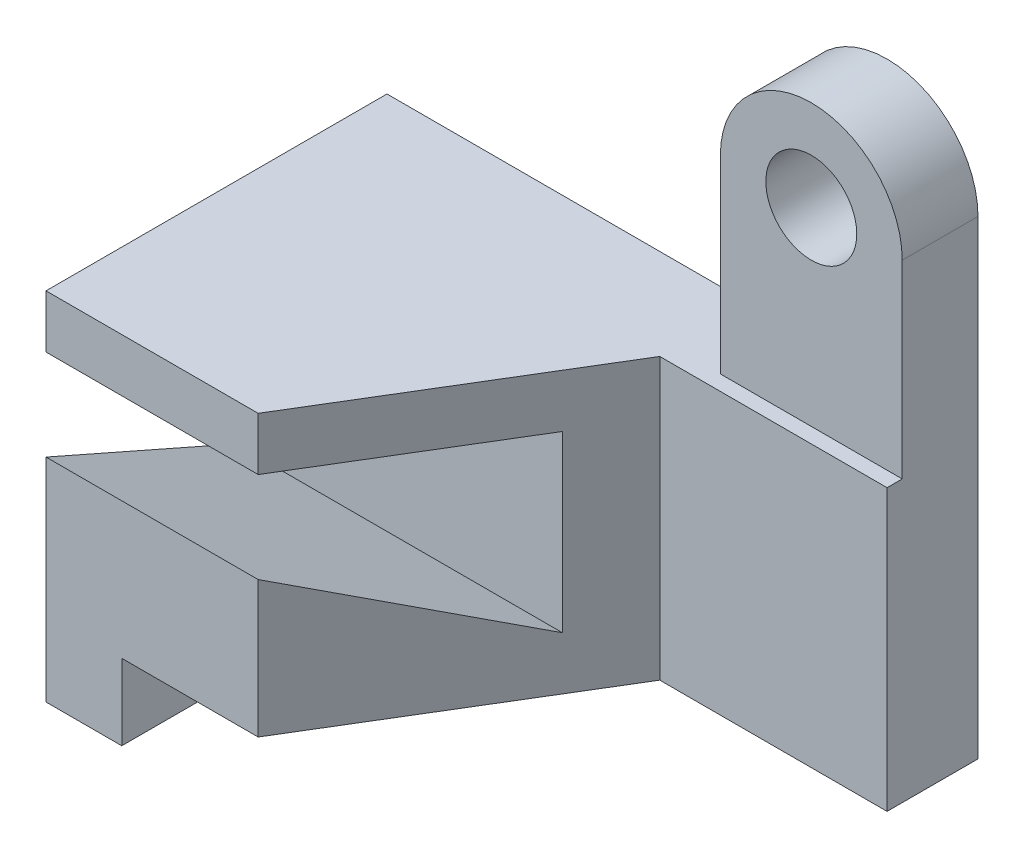
ISO-10303-21;
HEADER;
FILE_DESCRIPTION(('STEP AP214'),'2;1');
FILE_NAME('part.step','',(''),(''),'','','');
FILE_SCHEMA(('AUTOMOTIVE_DESIGN { 1 0 10303 214 1 1 1 1 }'));
ENDSEC;
DATA;
#1=APPLICATION_CONTEXT('core data for automotive mechanical design processes');
#2=APPLICATION_PROTOCOL_DEFINITION('international standard','automotive_design',2000,#1);
#3=PRODUCT_CONTEXT('',#1,'mechanical');
#4=PRODUCT('Part','Part','',(#3));
#5=PRODUCT_RELATED_PRODUCT_CATEGORY('part','',(#4));
#6=PRODUCT_DEFINITION_FORMATION('','',#4);
#7=PRODUCT_DEFINITION_CONTEXT('part definition',#1,'design');
#8=PRODUCT_DEFINITION('design','',#6,#7);
#9=PRODUCT_DEFINITION_SHAPE('','',#8);
#10=(LENGTH_UNIT() NAMED_UNIT(*) SI_UNIT(.MILLI.,.METRE.));
#11=(NAMED_UNIT(*) PLANE_ANGLE_UNIT() SI_UNIT($,.RADIAN.));
#12=(NAMED_UNIT(*) SI_UNIT($,.STERADIAN.) SOLID_ANGLE_UNIT());
#13=UNCERTAINTY_MEASURE_WITH_UNIT(LENGTH_MEASURE(1.E-05),#10,'distance_accuracy_value','');
#14=(GEOMETRIC_REPRESENTATION_CONTEXT(3) GLOBAL_UNCERTAINTY_ASSIGNED_CONTEXT((#13)) GLOBAL_UNIT_ASSIGNED_CONTEXT((#10,
#11,#12)) REPRESENTATION_CONTEXT('',''));
#15=CARTESIAN_POINT('',(0.,0.,0.));
#16=DIRECTION('',(0.,0.,1.));
#17=DIRECTION('',(1.,0.,0.));
#18=AXIS2_PLACEMENT_3D('',#15,#16,#17);
#19=CARTESIAN_POINT('',(0.,-18.5,0.));
#20=DIRECTION('',(0.,1.,0.));
#21=DIRECTION('',(0.,0.,1.));
#22=AXIS2_PLACEMENT_3D('',#19,#20,#21);
#23=PLANE('',#22);
#24=DIRECTION('',(0.,0.,1.));
#25=VECTOR('',#24,1.);
#26=CARTESIAN_POINT('',(-68.,-18.5,0.));
#27=LINE('',#26,#25);
#28=CARTESIAN_POINT('',(-68.,-18.5,0.));
#29=VERTEX_POINT('',#28);
#30=CARTESIAN_POINT('',(-68.,-18.5,45.));
#31=VERTEX_POINT('',#30);
#32=EDGE_CURVE('E54',#29,#31,#27,.T.);
#33=ORIENTED_EDGE('',*,*,#32,.F.);
#34=DIRECTION('',(-1.,0.,0.));
#35=VECTOR('',#34,1.);
#36=CARTESIAN_POINT('',(0.,-18.5,0.));
#37=LINE('',#36,#35);
#38=CARTESIAN_POINT('',(0.,-18.5,0.));
#39=VERTEX_POINT('',#38);
#40=EDGE_CURVE('E247',#39,#29,#37,.T.);
#41=ORIENTED_EDGE('',*,*,#40,.F.);
#42=DIRECTION('',(0.,0.,-1.));
#43=VECTOR('',#42,1.);
#44=CARTESIAN_POINT('',(0.,-18.5,12.));
#45=LINE('',#44,#43);
#46=CARTESIAN_POINT('',(0.,-18.5,12.));
#47=VERTEX_POINT('',#46);
#48=EDGE_CURVE('E215',#47,#39,#45,.T.);
#49=ORIENTED_EDGE('',*,*,#48,.F.);
#50=DIRECTION('',(1.,0.,0.));
#51=VECTOR('',#50,1.);
#52=CARTESIAN_POINT('',(-30.,-18.5,12.));
#53=LINE('',#52,#51);
#54=CARTESIAN_POINT('',(-30.,-18.5,12.));
#55=VERTEX_POINT('',#54);
#56=EDGE_CURVE('E235',#55,#47,#53,.T.);
#57=ORIENTED_EDGE('',*,*,#56,.F.);
#58=DIRECTION('',(0.518301716093344,0.,-0.855197831554018));
#59=VECTOR('',#58,1.);
#60=CARTESIAN_POINT('',(-50.,-18.5,45.));
#61=LINE('',#60,#59);
#62=CARTESIAN_POINT('',(-50.,-18.5,45.));
#63=VERTEX_POINT('',#62);
#64=EDGE_CURVE('E251',#63,#55,#61,.T.);
#65=ORIENTED_EDGE('',*,*,#64,.F.);
#66=DIRECTION('',(1.,0.,0.));
#67=VECTOR('',#66,1.);
#68=CARTESIAN_POINT('',(-78.,-18.5,45.));
#69=LINE('',#68,#67);
#70=EDGE_CURVE('E249',#31,#63,#69,.T.);
#71=ORIENTED_EDGE('',*,*,#70,.F.);
#72=EDGE_LOOP('',(#33,#41,#49,#57,#65,#71));
#73=FACE_BOUND('',#72,.T.);
#74=ADVANCED_FACE('F39',(#73),#23,.F.);
#75=CARTESIAN_POINT('',(-78.,18.5,45.));
#76=DIRECTION('',(0.,0.,-1.));
#77=DIRECTION('',(-1.,0.,0.));
#78=AXIS2_PLACEMENT_3D('',#75,#76,#77);
#79=PLANE('',#78);
#80=DIRECTION('',(1.,0.,0.));
#81=VECTOR('',#80,1.);
#82=CARTESIAN_POINT('',(-78.,-0.5,45.));
#83=LINE('',#82,#81);
#84=CARTESIAN_POINT('',(-78.,-0.5,45.));
#85=VERTEX_POINT('',#84);
#86=CARTESIAN_POINT('',(-50.,-0.499999999999996,45.));
#87=VERTEX_POINT('',#86);
#88=EDGE_CURVE('E224',#85,#87,#83,.T.);
#89=ORIENTED_EDGE('',*,*,#88,.F.);
#90=DIRECTION('',(0.,-1.,0.));
#91=VECTOR('',#90,1.);
#92=CARTESIAN_POINT('',(-78.,18.5,45.));
#93=LINE('',#92,#91);
#94=CARTESIAN_POINT('',(-78.,-28.5,45.));
#95=VERTEX_POINT('',#94);
#96=EDGE_CURVE('E263',#85,#95,#93,.T.);
#97=ORIENTED_EDGE('',*,*,#96,.T.);
#98=DIRECTION('',(1.,0.,0.));
#99=VECTOR('',#98,1.);
#100=CARTESIAN_POINT('',(-78.,-28.5,45.));
#101=LINE('',#100,#99);
#102=CARTESIAN_POINT('',(-68.,-28.5,45.));
#103=VERTEX_POINT('',#102);
#104=EDGE_CURVE('E165',#95,#103,#101,.T.);
#105=ORIENTED_EDGE('',*,*,#104,.T.);
#106=DIRECTION('',(0.,1.,0.));
#107=VECTOR('',#106,1.);
#108=CARTESIAN_POINT('',(-68.,-18.5,45.));
#109=LINE('',#108,#107);
#110=EDGE_CURVE('E174',#103,#31,#109,.T.);
#111=ORIENTED_EDGE('',*,*,#110,.T.);
#112=ORIENTED_EDGE('',*,*,#70,.T.);
#113=DIRECTION('',(0.,-1.,0.));
#114=VECTOR('',#113,1.);
#115=CARTESIAN_POINT('',(-50.,18.5,45.));
#116=LINE('',#115,#114);
#117=EDGE_CURVE('E259',#87,#63,#116,.T.);
#118=ORIENTED_EDGE('',*,*,#117,.F.);
#119=EDGE_LOOP('',(#89,#97,#105,#111,#112,#118));
#120=FACE_BOUND('',#119,.T.);
#121=ADVANCED_FACE('F312',(#120),#79,.F.);
#122=CARTESIAN_POINT('',(-78.,18.5,0.));
#123=DIRECTION('',(1.,0.,0.));
#124=DIRECTION('',(0.,0.,-1.));
#125=AXIS2_PLACEMENT_3D('',#122,#123,#124);
#126=PLANE('',#125);
#127=DIRECTION('',(0.,0.,-1.));
#128=VECTOR('',#127,1.);
#129=CARTESIAN_POINT('',(-78.,11.5,45.));
#130=LINE('',#129,#128);
#131=CARTESIAN_POINT('',(-78.,11.5,45.));
#132=VERTEX_POINT('',#131);
#133=CARTESIAN_POINT('',(-78.,11.5,20.));
#134=VERTEX_POINT('',#133);
#135=EDGE_CURVE('E212',#132,#134,#130,.T.);
#136=ORIENTED_EDGE('',*,*,#135,.F.);
#137=CARTESIAN_POINT('',(-78.,18.5,45.));
#138=VERTEX_POINT('',#137);
#139=EDGE_CURVE('E158',#138,#132,#93,.T.);
#140=ORIENTED_EDGE('',*,*,#139,.F.);
#141=DIRECTION('',(0.,0.,1.));
#142=VECTOR('',#141,1.);
#143=CARTESIAN_POINT('',(-78.,18.5,0.));
#144=LINE('',#143,#142);
#145=CARTESIAN_POINT('',(-78.,18.5,0.));
#146=VERTEX_POINT('',#145);
#147=EDGE_CURVE('E154',#146,#138,#144,.T.);
#148=ORIENTED_EDGE('',*,*,#147,.F.);
#149=DIRECTION('',(0.,-1.,0.));
#150=VECTOR('',#149,1.);
#151=CARTESIAN_POINT('',(-78.,18.5,0.));
#152=LINE('',#151,#150);
#153=CARTESIAN_POINT('',(-78.,-28.5,0.));
#154=VERTEX_POINT('',#153);
#155=EDGE_CURVE('E147',#146,#154,#152,.T.);
#156=ORIENTED_EDGE('',*,*,#155,.T.);
#157=DIRECTION('',(0.,0.,1.));
#158=VECTOR('',#157,1.);
#159=CARTESIAN_POINT('',(-78.,-28.5,0.));
#160=LINE('',#159,#158);
#161=EDGE_CURVE('E151',#154,#95,#160,.T.);
#162=ORIENTED_EDGE('',*,*,#161,.T.);
#163=ORIENTED_EDGE('',*,*,#96,.F.);
#164=DIRECTION('',(0.,0.402738614266017,0.915315032422766));
#165=VECTOR('',#164,1.);
#166=CARTESIAN_POINT('',(-78.,-11.5,20.));
#167=LINE('',#166,#165);
#168=CARTESIAN_POINT('',(-78.,-11.5,20.));
#169=VERTEX_POINT('',#168);
#170=EDGE_CURVE('E221',#169,#85,#167,.T.);
#171=ORIENTED_EDGE('',*,*,#170,.F.);
#172=DIRECTION('',(0.,-1.,0.));
#173=VECTOR('',#172,1.);
#174=CARTESIAN_POINT('',(-78.,11.5,20.));
#175=LINE('',#174,#173);
#176=EDGE_CURVE('E217',#134,#169,#175,.T.);
#177=ORIENTED_EDGE('',*,*,#176,.F.);
#178=EDGE_LOOP('',(#136,#140,#148,#156,#162,#163,#171,#177));
#179=FACE_BOUND('',#178,.T.);
#180=ADVANCED_FACE('F149',(#179),#126,.F.);
#181=CARTESIAN_POINT('',(-50.,18.5,45.));
#182=DIRECTION('',(-0.855197831554018,0.,-0.518301716093344));
#183=DIRECTION('',(-0.518301716093345,0.,0.855197831554018));
#184=AXIS2_PLACEMENT_3D('',#181,#182,#183);
#185=PLANE('',#184);
#186=DIRECTION('',(-0.518301716093345,0.,0.855197831554018));
#187=VECTOR('',#186,1.);
#188=CARTESIAN_POINT('',(-50.,11.5,45.));
#189=LINE('',#188,#187);
#190=CARTESIAN_POINT('',(-34.8484848484848,11.5,20.));
#191=VERTEX_POINT('',#190);
#192=CARTESIAN_POINT('',(-50.,11.5,45.));
#193=VERTEX_POINT('',#192);
#194=EDGE_CURVE('E11',#191,#193,#189,.T.);
#195=ORIENTED_EDGE('',*,*,#194,.F.);
#196=DIRECTION('',(0.,1.,0.));
#197=VECTOR('',#196,1.);
#198=CARTESIAN_POINT('',(-34.8484848484848,18.5,20.));
#199=LINE('',#198,#197);
#200=CARTESIAN_POINT('',(-34.8484848484849,-11.5,20.));
#201=VERTEX_POINT('',#200);
#202=EDGE_CURVE('E47',#201,#191,#199,.T.);
#203=ORIENTED_EDGE('',*,*,#202,.F.);
#204=DIRECTION('',(0.485095448378582,-0.35217929552285,-0.800407489824659));
#205=VECTOR('',#204,1.);
#206=CARTESIAN_POINT('',(-53.2459708921549,1.85657486770445,50.3558519720556));
#207=LINE('',#206,#205);
#208=EDGE_CURVE('E268',#87,#201,#207,.T.);
#209=ORIENTED_EDGE('',*,*,#208,.F.);
#210=ORIENTED_EDGE('',*,*,#117,.T.);
#211=ORIENTED_EDGE('',*,*,#64,.T.);
#212=DIRECTION('',(0.,-1.,0.));
#213=VECTOR('',#212,1.);
#214=CARTESIAN_POINT('',(-30.,18.5,12.));
#215=LINE('',#214,#213);
#216=CARTESIAN_POINT('',(-30.,18.5,12.));
#217=VERTEX_POINT('',#216);
#218=EDGE_CURVE('E256',#217,#55,#215,.T.);
#219=ORIENTED_EDGE('',*,*,#218,.F.);
#220=DIRECTION('',(0.518301716093344,0.,-0.855197831554018));
#221=VECTOR('',#220,1.);
#222=CARTESIAN_POINT('',(-50.,18.5,45.));
#223=LINE('',#222,#221);
#224=CARTESIAN_POINT('',(-50.,18.5,45.));
#225=VERTEX_POINT('',#224);
#226=EDGE_CURVE('E240',#225,#217,#223,.T.);
#227=ORIENTED_EDGE('',*,*,#226,.F.);
#228=EDGE_CURVE('E260',#225,#193,#116,.T.);
#229=ORIENTED_EDGE('',*,*,#228,.T.);
#230=EDGE_LOOP('',(#195,#203,#209,#210,#211,#219,#227,#229));
#231=FACE_BOUND('',#230,.T.);
#232=ADVANCED_FACE('F308',(#231),#185,.F.);
#233=CARTESIAN_POINT('',(0.,18.5,12.));
#234=DIRECTION('',(-1.,0.,0.));
#235=DIRECTION('',(0.,0.,1.));
#236=AXIS2_PLACEMENT_3D('',#233,#234,#235);
#237=PLANE('',#236);
#238=ORIENTED_EDGE('',*,*,#48,.T.);
#239=DIRECTION('',(0.,-1.,0.));
#240=VECTOR('',#239,1.);
#241=CARTESIAN_POINT('',(0.,18.5,0.));
#242=LINE('',#241,#240);
#243=CARTESIAN_POINT('',(0.,43.5,0.));
#244=VERTEX_POINT('',#243);
#245=EDGE_CURVE('E157',#244,#39,#242,.T.);
#246=ORIENTED_EDGE('',*,*,#245,.F.);
#247=DIRECTION('',(0.,0.,-1.));
#248=VECTOR('',#247,1.);
#249=CARTESIAN_POINT('',(0.,43.5,10.));
#250=LINE('',#249,#248);
#251=CARTESIAN_POINT('',(0.,43.5,10.));
#252=VERTEX_POINT('',#251);
#253=EDGE_CURVE('E194',#252,#244,#250,.T.);
#254=ORIENTED_EDGE('',*,*,#253,.F.);
#255=DIRECTION('',(0.,-1.,0.));
#256=VECTOR('',#255,1.);
#257=CARTESIAN_POINT('',(0.,43.5,10.));
#258=LINE('',#257,#256);
#259=CARTESIAN_POINT('',(0.,18.5,10.));
#260=VERTEX_POINT('',#259);
#261=EDGE_CURVE('E199',#252,#260,#258,.T.);
#262=ORIENTED_EDGE('',*,*,#261,.T.);
#263=DIRECTION('',(0.,0.,-1.));
#264=VECTOR('',#263,1.);
#265=CARTESIAN_POINT('',(0.,18.5,12.));
#266=LINE('',#265,#264);
#267=CARTESIAN_POINT('',(0.,18.5,12.));
#268=VERTEX_POINT('',#267);
#269=EDGE_CURVE('E232',#268,#260,#266,.T.);
#270=ORIENTED_EDGE('',*,*,#269,.F.);
#271=DIRECTION('',(0.,-1.,0.));
#272=VECTOR('',#271,1.);
#273=CARTESIAN_POINT('',(0.,18.5,12.));
#274=LINE('',#273,#272);
#275=EDGE_CURVE('E244',#268,#47,#274,.T.);
#276=ORIENTED_EDGE('',*,*,#275,.T.);
#277=EDGE_LOOP('',(#238,#246,#254,#262,#270,#276));
#278=FACE_BOUND('',#277,.T.);
#279=ADVANCED_FACE('F41',(#278),#237,.F.);
#280=CARTESIAN_POINT('',(0.,18.5,0.));
#281=DIRECTION('',(0.,0.,1.));
#282=DIRECTION('',(1.,0.,0.));
#283=AXIS2_PLACEMENT_3D('',#280,#281,#282);
#284=PLANE('',#283);
#285=DIRECTION('',(0.,-1.,0.));
#286=VECTOR('',#285,1.);
#287=CARTESIAN_POINT('',(-24.,43.5,0.));
#288=LINE('',#287,#286);
#289=CARTESIAN_POINT('',(-24.,43.5,0.));
#290=VERTEX_POINT('',#289);
#291=CARTESIAN_POINT('',(-24.,18.5,0.));
#292=VERTEX_POINT('',#291);
#293=EDGE_CURVE('E208',#290,#292,#288,.T.);
#294=ORIENTED_EDGE('',*,*,#293,.F.);
#295=CARTESIAN_POINT('',(-12.,43.5,0.));
#296=DIRECTION('',(0.,0.,1.));
#297=DIRECTION('',(1.,0.,0.));
#298=AXIS2_PLACEMENT_3D('',#295,#296,#297);
#299=CIRCLE('',#298,12.);
#300=EDGE_CURVE('E190',#244,#290,#299,.T.);
#301=ORIENTED_EDGE('',*,*,#300,.F.);
#302=ORIENTED_EDGE('',*,*,#245,.T.);
#303=ORIENTED_EDGE('',*,*,#40,.T.);
#304=DIRECTION('',(0.,1.,0.));
#305=VECTOR('',#304,1.);
#306=CARTESIAN_POINT('',(-68.,-18.5,0.));
#307=LINE('',#306,#305);
#308=CARTESIAN_POINT('',(-68.,-28.5,0.));
#309=VERTEX_POINT('',#308);
#310=EDGE_CURVE('E167',#309,#29,#307,.T.);
#311=ORIENTED_EDGE('',*,*,#310,.F.);
#312=DIRECTION('',(1.,0.,0.));
#313=VECTOR('',#312,1.);
#314=CARTESIAN_POINT('',(-78.,-28.5,0.));
#315=LINE('',#314,#313);
#316=EDGE_CURVE('E163',#154,#309,#315,.T.);
#317=ORIENTED_EDGE('',*,*,#316,.F.);
#318=ORIENTED_EDGE('',*,*,#155,.F.);
#319=DIRECTION('',(-1.,0.,0.));
#320=VECTOR('',#319,1.);
#321=CARTESIAN_POINT('',(0.,18.5,0.));
#322=LINE('',#321,#320);
#323=EDGE_CURVE('E234',#292,#146,#322,.T.);
#324=ORIENTED_EDGE('',*,*,#323,.F.);
#325=EDGE_LOOP('',(#294,#301,#302,#303,#311,#317,#318,#324));
#326=FACE_BOUND('',#325,.T.);
#327=CARTESIAN_POINT('',(-12.,43.5,0.));
#328=DIRECTION('',(0.,0.,1.));
#329=DIRECTION('',(1.,0.,0.));
#330=AXIS2_PLACEMENT_3D('',#327,#328,#329);
#331=CIRCLE('',#330,6.);
#332=CARTESIAN_POINT('',(-6.,43.5,0.));
#333=VERTEX_POINT('',#332);
#334=EDGE_CURVE('E184',#333,#333,#331,.T.);
#335=ORIENTED_EDGE('',*,*,#334,.T.);
#336=EDGE_LOOP('',(#335));
#337=FACE_BOUND('',#336,.T.);
#338=ADVANCED_FACE('F171',(#326,#337),#284,.F.);
#339=ORIENTED_EDGE('',*,*,#139,.T.);
#340=DIRECTION('',(1.,0.,0.));
#341=VECTOR('',#340,1.);
#342=CARTESIAN_POINT('',(-78.,11.5,45.));
#343=LINE('',#342,#341);
#344=EDGE_CURVE('E216',#132,#193,#343,.T.);
#345=ORIENTED_EDGE('',*,*,#344,.T.);
#346=ORIENTED_EDGE('',*,*,#228,.F.);
#347=DIRECTION('',(1.,0.,0.));
#348=VECTOR('',#347,1.);
#349=CARTESIAN_POINT('',(-78.,18.5,45.));
#350=LINE('',#349,#348);
#351=EDGE_CURVE('E238',#138,#225,#350,.T.);
#352=ORIENTED_EDGE('',*,*,#351,.F.);
#353=EDGE_LOOP('',(#339,#345,#346,#352));
#354=FACE_BOUND('',#353,.T.);
#355=ADVANCED_FACE('F281',(#354),#79,.F.);
#356=CARTESIAN_POINT('',(-30.,18.5,12.));
#357=DIRECTION('',(0.,0.,-1.));
#358=DIRECTION('',(-1.,0.,0.));
#359=AXIS2_PLACEMENT_3D('',#356,#357,#358);
#360=PLANE('',#359);
#361=ORIENTED_EDGE('',*,*,#56,.T.);
#362=ORIENTED_EDGE('',*,*,#275,.F.);
#363=DIRECTION('',(1.,0.,0.));
#364=VECTOR('',#363,1.);
#365=CARTESIAN_POINT('',(-30.,18.5,12.));
#366=LINE('',#365,#364);
#367=EDGE_CURVE('E242',#217,#268,#366,.T.);
#368=ORIENTED_EDGE('',*,*,#367,.F.);
#369=ORIENTED_EDGE('',*,*,#218,.T.);
#370=EDGE_LOOP('',(#361,#362,#368,#369));
#371=FACE_BOUND('',#370,.T.);
#372=ADVANCED_FACE('F306',(#371),#360,.F.);
#373=CARTESIAN_POINT('',(0.,18.5,0.));
#374=DIRECTION('',(0.,1.,0.));
#375=DIRECTION('',(0.,0.,1.));
#376=AXIS2_PLACEMENT_3D('',#373,#374,#375);
#377=PLANE('',#376);
#378=DIRECTION('',(1.,0.,0.));
#379=VECTOR('',#378,1.);
#380=CARTESIAN_POINT('',(-24.,18.5,10.));
#381=LINE('',#380,#379);
#382=CARTESIAN_POINT('',(-24.,18.5,10.));
#383=VERTEX_POINT('',#382);
#384=EDGE_CURVE('E197',#383,#260,#381,.T.);
#385=ORIENTED_EDGE('',*,*,#384,.F.);
#386=DIRECTION('',(0.,0.,1.));
#387=VECTOR('',#386,1.);
#388=CARTESIAN_POINT('',(-24.,18.5,0.));
#389=LINE('',#388,#387);
#390=EDGE_CURVE('E62',#292,#383,#389,.T.);
#391=ORIENTED_EDGE('',*,*,#390,.F.);
#392=ORIENTED_EDGE('',*,*,#323,.T.);
#393=ORIENTED_EDGE('',*,*,#147,.T.);
#394=ORIENTED_EDGE('',*,*,#351,.T.);
#395=ORIENTED_EDGE('',*,*,#226,.T.);
#396=ORIENTED_EDGE('',*,*,#367,.T.);
#397=ORIENTED_EDGE('',*,*,#269,.T.);
#398=EDGE_LOOP('',(#385,#391,#392,#393,#394,#395,#396,#397));
#399=FACE_BOUND('',#398,.T.);
#400=ADVANCED_FACE('F284',(#399),#377,.T.);
#401=CARTESIAN_POINT('',(-78.,11.5,45.));
#402=DIRECTION('',(0.,-1.,0.));
#403=DIRECTION('',(0.,0.,-1.));
#404=AXIS2_PLACEMENT_3D('',#401,#402,#403);
#405=PLANE('',#404);
#406=DIRECTION('',(1.,0.,0.));
#407=VECTOR('',#406,1.);
#408=CARTESIAN_POINT('',(-78.,11.5,20.));
#409=LINE('',#408,#407);
#410=EDGE_CURVE('E220',#134,#191,#409,.T.);
#411=ORIENTED_EDGE('',*,*,#410,.T.);
#412=ORIENTED_EDGE('',*,*,#194,.T.);
#413=ORIENTED_EDGE('',*,*,#344,.F.);
#414=ORIENTED_EDGE('',*,*,#135,.T.);
#415=EDGE_LOOP('',(#411,#412,#413,#414));
#416=FACE_BOUND('',#415,.T.);
#417=ADVANCED_FACE('F277',(#416),#405,.T.);
#418=CARTESIAN_POINT('',(-78.,11.5,20.));
#419=DIRECTION('',(0.,0.,1.));
#420=DIRECTION('',(0.,-1.,0.));
#421=AXIS2_PLACEMENT_3D('',#418,#419,#420);
#422=PLANE('',#421);
#423=DIRECTION('',(1.,0.,0.));
#424=VECTOR('',#423,1.);
#425=CARTESIAN_POINT('',(-78.,-11.5,20.));
#426=LINE('',#425,#424);
#427=EDGE_CURVE('E211',#169,#201,#426,.T.);
#428=ORIENTED_EDGE('',*,*,#427,.T.);
#429=ORIENTED_EDGE('',*,*,#202,.T.);
#430=ORIENTED_EDGE('',*,*,#410,.F.);
#431=ORIENTED_EDGE('',*,*,#176,.T.);
#432=EDGE_LOOP('',(#428,#429,#430,#431));
#433=FACE_BOUND('',#432,.T.);
#434=ADVANCED_FACE('F273',(#433),#422,.T.);
#435=CARTESIAN_POINT('',(-78.,-11.5,20.));
#436=DIRECTION('',(0.,0.915315032422766,-0.402738614266017));
#437=DIRECTION('',(0.,0.402738614266017,0.915315032422766));
#438=AXIS2_PLACEMENT_3D('',#435,#436,#437);
#439=PLANE('',#438);
#440=ORIENTED_EDGE('',*,*,#88,.T.);
#441=ORIENTED_EDGE('',*,*,#208,.T.);
#442=ORIENTED_EDGE('',*,*,#427,.F.);
#443=ORIENTED_EDGE('',*,*,#170,.T.);
#444=EDGE_LOOP('',(#440,#441,#442,#443));
#445=FACE_BOUND('',#444,.T.);
#446=ADVANCED_FACE('F314',(#445),#439,.T.);
#447=CARTESIAN_POINT('',(-24.,43.5,0.));
#448=DIRECTION('',(1.,0.,0.));
#449=DIRECTION('',(0.,0.,-1.));
#450=AXIS2_PLACEMENT_3D('',#447,#448,#449);
#451=PLANE('',#450);
#452=ORIENTED_EDGE('',*,*,#390,.T.);
#453=DIRECTION('',(0.,-1.,0.));
#454=VECTOR('',#453,1.);
#455=CARTESIAN_POINT('',(-24.,43.5,10.));
#456=LINE('',#455,#454);
#457=CARTESIAN_POINT('',(-24.,43.5,10.));
#458=VERTEX_POINT('',#457);
#459=EDGE_CURVE('E205',#458,#383,#456,.T.);
#460=ORIENTED_EDGE('',*,*,#459,.F.);
#461=DIRECTION('',(0.,0.,1.));
#462=VECTOR('',#461,1.);
#463=CARTESIAN_POINT('',(-24.,43.5,0.));
#464=LINE('',#463,#462);
#465=EDGE_CURVE('E196',#290,#458,#464,.T.);
#466=ORIENTED_EDGE('',*,*,#465,.F.);
#467=ORIENTED_EDGE('',*,*,#293,.T.);
#468=EDGE_LOOP('',(#452,#460,#466,#467));
#469=FACE_BOUND('',#468,.T.);
#470=ADVANCED_FACE('F289',(#469),#451,.F.);
#471=CARTESIAN_POINT('',(-24.,43.5,10.));
#472=DIRECTION('',(0.,0.,-1.));
#473=DIRECTION('',(-1.,0.,0.));
#474=AXIS2_PLACEMENT_3D('',#471,#472,#473);
#475=PLANE('',#474);
#476=ORIENTED_EDGE('',*,*,#261,.F.);
#477=CARTESIAN_POINT('',(-12.,43.5,10.));
#478=DIRECTION('',(0.,0.,1.));
#479=DIRECTION('',(1.,0.,0.));
#480=AXIS2_PLACEMENT_3D('',#477,#478,#479);
#481=CIRCLE('',#480,12.);
#482=EDGE_CURVE('E187',#252,#458,#481,.T.);
#483=ORIENTED_EDGE('',*,*,#482,.T.);
#484=ORIENTED_EDGE('',*,*,#459,.T.);
#485=ORIENTED_EDGE('',*,*,#384,.T.);
#486=EDGE_LOOP('',(#476,#483,#484,#485));
#487=FACE_BOUND('',#486,.T.);
#488=CARTESIAN_POINT('',(-12.,43.5,10.));
#489=DIRECTION('',(0.,0.,1.));
#490=DIRECTION('',(1.,0.,0.));
#491=AXIS2_PLACEMENT_3D('',#488,#489,#490);
#492=CIRCLE('',#491,6.);
#493=CARTESIAN_POINT('',(-6.,43.5,10.));
#494=VERTEX_POINT('',#493);
#495=EDGE_CURVE('E182',#494,#494,#492,.T.);
#496=ORIENTED_EDGE('',*,*,#495,.F.);
#497=EDGE_LOOP('',(#496));
#498=FACE_BOUND('',#497,.T.);
#499=ADVANCED_FACE('F295',(#487,#498),#475,.F.);
#500=CARTESIAN_POINT('',(-12.,43.5,0.));
#501=DIRECTION('',(0.,0.,1.));
#502=DIRECTION('',(1.,0.,0.));
#503=AXIS2_PLACEMENT_3D('',#500,#501,#502);
#504=CYLINDRICAL_SURFACE('',#503,12.);
#505=ORIENTED_EDGE('',*,*,#300,.T.);
#506=ORIENTED_EDGE('',*,*,#465,.T.);
#507=ORIENTED_EDGE('',*,*,#482,.F.);
#508=ORIENTED_EDGE('',*,*,#253,.T.);
#509=EDGE_LOOP('',(#505,#506,#507,#508));
#510=FACE_BOUND('',#509,.T.);
#511=ADVANCED_FACE('F292',(#510),#504,.T.);
#512=CARTESIAN_POINT('',(-12.,43.5,0.));
#513=DIRECTION('',(0.,0.,1.));
#514=DIRECTION('',(1.,0.,0.));
#515=AXIS2_PLACEMENT_3D('',#512,#513,#514);
#516=CYLINDRICAL_SURFACE('',#515,6.);
#517=ORIENTED_EDGE('',*,*,#495,.T.);
#518=EDGE_LOOP('',(#517));
#519=FACE_BOUND('',#518,.T.);
#520=ORIENTED_EDGE('',*,*,#334,.F.);
#521=EDGE_LOOP('',(#520));
#522=FACE_BOUND('',#521,.T.);
#523=ADVANCED_FACE('F319',(#519,#522),#516,.F.);
#524=CARTESIAN_POINT('',(-68.,-18.5,0.));
#525=DIRECTION('',(1.,0.,0.));
#526=DIRECTION('',(0.,0.,-1.));
#527=AXIS2_PLACEMENT_3D('',#524,#525,#526);
#528=PLANE('',#527);
#529=ORIENTED_EDGE('',*,*,#110,.F.);
#530=DIRECTION('',(0.,0.,1.));
#531=VECTOR('',#530,1.);
#532=CARTESIAN_POINT('',(-68.,-28.5,0.));
#533=LINE('',#532,#531);
#534=EDGE_CURVE('E166',#309,#103,#533,.T.);
#535=ORIENTED_EDGE('',*,*,#534,.F.);
#536=ORIENTED_EDGE('',*,*,#310,.T.);
#537=ORIENTED_EDGE('',*,*,#32,.T.);
#538=EDGE_LOOP('',(#529,#535,#536,#537));
#539=FACE_BOUND('',#538,.T.);
#540=ADVANCED_FACE('F317',(#539),#528,.T.);
#541=CARTESIAN_POINT('',(-78.,-28.5,0.));
#542=DIRECTION('',(0.,-1.,0.));
#543=DIRECTION('',(1.,0.,0.));
#544=AXIS2_PLACEMENT_3D('',#541,#542,#543);
#545=PLANE('',#544);
#546=ORIENTED_EDGE('',*,*,#104,.F.);
#547=ORIENTED_EDGE('',*,*,#161,.F.);
#548=ORIENTED_EDGE('',*,*,#316,.T.);
#549=ORIENTED_EDGE('',*,*,#534,.T.);
#550=EDGE_LOOP('',(#546,#547,#548,#549));
#551=FACE_BOUND('',#550,.T.);
#552=ADVANCED_FACE('F162',(#551),#545,.T.);
#553=CLOSED_SHELL('',(#74,#121,#180,#232,#279,#338,#355,#372,#400,#417,#434,#446,#470,#499,#511,
#523,#540,#552));
#554=MANIFOLD_SOLID_BREP('B2',#553);
#555=ADVANCED_BREP_SHAPE_REPRESENTATION('',(#18,#554),#14);
#556=SHAPE_DEFINITION_REPRESENTATION(#9,#555);
ENDSEC;
END-ISO-10303-21;
